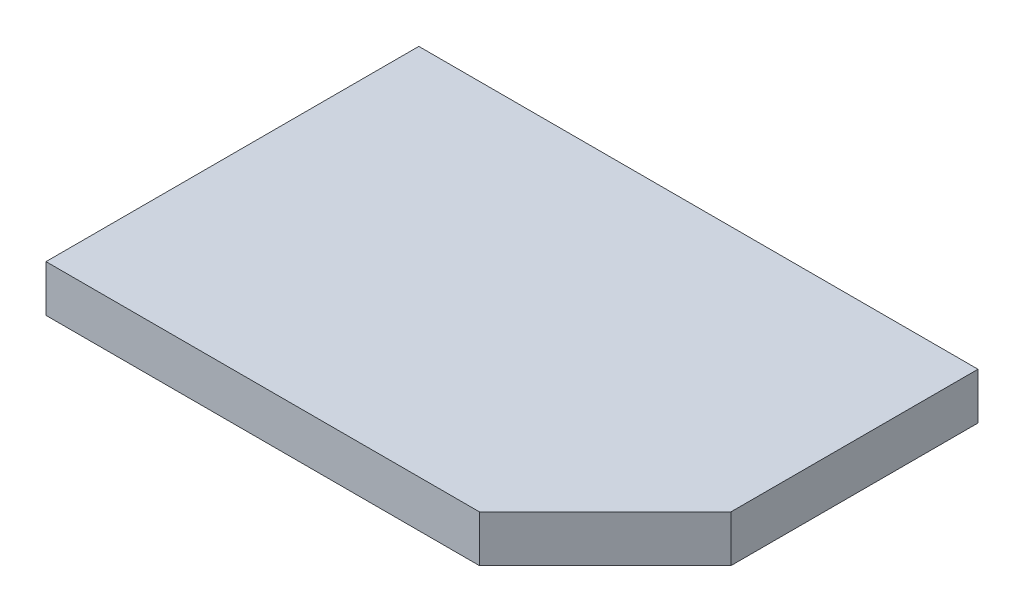
ISO-10303-21;
HEADER;
FILE_DESCRIPTION(('STEP AP214'),'2;1');
FILE_NAME('part.step','',(''),(''),'','','');
FILE_SCHEMA(('AUTOMOTIVE_DESIGN { 1 0 10303 214 1 1 1 1 }'));
ENDSEC;
DATA;
#1=APPLICATION_CONTEXT('core data for automotive mechanical design processes');
#2=APPLICATION_PROTOCOL_DEFINITION('international standard','automotive_design',2000,#1);
#3=PRODUCT_CONTEXT('',#1,'mechanical');
#4=PRODUCT('Part','Part','',(#3));
#5=PRODUCT_RELATED_PRODUCT_CATEGORY('part','',(#4));
#6=PRODUCT_DEFINITION_FORMATION('','',#4);
#7=PRODUCT_DEFINITION_CONTEXT('part definition',#1,'design');
#8=PRODUCT_DEFINITION('design','',#6,#7);
#9=PRODUCT_DEFINITION_SHAPE('','',#8);
#10=(LENGTH_UNIT() NAMED_UNIT(*) SI_UNIT(.MILLI.,.METRE.));
#11=(NAMED_UNIT(*) PLANE_ANGLE_UNIT() SI_UNIT($,.RADIAN.));
#12=(NAMED_UNIT(*) SI_UNIT($,.STERADIAN.) SOLID_ANGLE_UNIT());
#13=UNCERTAINTY_MEASURE_WITH_UNIT(LENGTH_MEASURE(1.E-05),#10,'distance_accuracy_value','');
#14=(GEOMETRIC_REPRESENTATION_CONTEXT(3) GLOBAL_UNCERTAINTY_ASSIGNED_CONTEXT((#13)) GLOBAL_UNIT_ASSIGNED_CONTEXT((#10,
#11,#12)) REPRESENTATION_CONTEXT('',''));
#15=CARTESIAN_POINT('',(0.,0.,0.));
#16=DIRECTION('',(0.,0.,1.));
#17=DIRECTION('',(1.,0.,0.));
#18=AXIS2_PLACEMENT_3D('',#15,#16,#17);
#19=CARTESIAN_POINT('',(-0.6,0.1,-0.4));
#20=DIRECTION('',(1.,0.,0.));
#21=DIRECTION('',(0.,0.,-1.));
#22=AXIS2_PLACEMENT_3D('',#19,#20,#21);
#23=PLANE('',#22);
#24=DIRECTION('',(0.,0.,1.));
#25=VECTOR('',#24,1.);
#26=CARTESIAN_POINT('',(-0.6,0.,-0.4));
#27=LINE('',#26,#25);
#28=CARTESIAN_POINT('',(-0.6,0.,-0.4));
#29=VERTEX_POINT('',#28);
#30=CARTESIAN_POINT('',(-0.6,0.,0.4));
#31=VERTEX_POINT('',#30);
#32=EDGE_CURVE('E95',#29,#31,#27,.T.);
#33=ORIENTED_EDGE('',*,*,#32,.T.);
#34=DIRECTION('',(0.,-1.,0.));
#35=VECTOR('',#34,1.);
#36=CARTESIAN_POINT('',(-0.6,0.1,0.4));
#37=LINE('',#36,#35);
#38=CARTESIAN_POINT('',(-0.6,0.1,0.4));
#39=VERTEX_POINT('',#38);
#40=EDGE_CURVE('E78',#39,#31,#37,.T.);
#41=ORIENTED_EDGE('',*,*,#40,.F.);
#42=DIRECTION('',(0.,0.,1.));
#43=VECTOR('',#42,1.);
#44=CARTESIAN_POINT('',(-0.6,0.1,-0.4));
#45=LINE('',#44,#43);
#46=CARTESIAN_POINT('',(-0.6,0.1,-0.4));
#47=VERTEX_POINT('',#46);
#48=EDGE_CURVE('E83',#47,#39,#45,.T.);
#49=ORIENTED_EDGE('',*,*,#48,.F.);
#50=DIRECTION('',(0.,-1.,0.));
#51=VECTOR('',#50,1.);
#52=CARTESIAN_POINT('',(-0.6,0.1,-0.4));
#53=LINE('',#52,#51);
#54=EDGE_CURVE('E102',#47,#29,#53,.T.);
#55=ORIENTED_EDGE('',*,*,#54,.T.);
#56=EDGE_LOOP('',(#33,#41,#49,#55));
#57=FACE_BOUND('',#56,.T.);
#58=ADVANCED_FACE('F31',(#57),#23,.F.);
#59=CARTESIAN_POINT('',(-0.6,0.1,0.4));
#60=DIRECTION('',(0.,0.,-1.));
#61=DIRECTION('',(-1.,0.,0.));
#62=AXIS2_PLACEMENT_3D('',#59,#60,#61);
#63=PLANE('',#62);
#64=DIRECTION('',(1.,0.,0.));
#65=VECTOR('',#64,1.);
#66=CARTESIAN_POINT('',(-0.6,0.,0.4));
#67=LINE('',#66,#65);
#68=CARTESIAN_POINT('',(0.329999999999999,0.,0.4));
#69=VERTEX_POINT('',#68);
#70=EDGE_CURVE('E110',#31,#69,#67,.T.);
#71=ORIENTED_EDGE('',*,*,#70,.T.);
#72=DIRECTION('',(0.,1.,0.));
#73=VECTOR('',#72,1.);
#74=CARTESIAN_POINT('',(0.329999999999999,0.1,0.4));
#75=LINE('',#74,#73);
#76=CARTESIAN_POINT('',(0.329999999999999,0.1,0.4));
#77=VERTEX_POINT('',#76);
#78=EDGE_CURVE('E39',#69,#77,#75,.T.);
#79=ORIENTED_EDGE('',*,*,#78,.T.);
#80=DIRECTION('',(1.,0.,0.));
#81=VECTOR('',#80,1.);
#82=CARTESIAN_POINT('',(-0.6,0.1,0.4));
#83=LINE('',#82,#81);
#84=EDGE_CURVE('E74',#39,#77,#83,.T.);
#85=ORIENTED_EDGE('',*,*,#84,.F.);
#86=ORIENTED_EDGE('',*,*,#40,.T.);
#87=EDGE_LOOP('',(#71,#79,#85,#86));
#88=FACE_BOUND('',#87,.T.);
#89=ADVANCED_FACE('F76',(#88),#63,.F.);
#90=CARTESIAN_POINT('',(0.6,0.1,-0.4));
#91=DIRECTION('',(-1.,0.,0.));
#92=DIRECTION('',(0.,0.,1.));
#93=AXIS2_PLACEMENT_3D('',#90,#91,#92);
#94=PLANE('',#93);
#95=DIRECTION('',(0.,0.,-1.));
#96=VECTOR('',#95,1.);
#97=CARTESIAN_POINT('',(0.6,0.1,-0.4));
#98=LINE('',#97,#96);
#99=CARTESIAN_POINT('',(0.6,0.1,0.13));
#100=VERTEX_POINT('',#99);
#101=CARTESIAN_POINT('',(0.6,0.1,-0.4));
#102=VERTEX_POINT('',#101);
#103=EDGE_CURVE('E82',#100,#102,#98,.T.);
#104=ORIENTED_EDGE('',*,*,#103,.F.);
#105=DIRECTION('',(0.,-1.,0.));
#106=VECTOR('',#105,1.);
#107=CARTESIAN_POINT('',(0.6,0.1,0.13));
#108=LINE('',#107,#106);
#109=CARTESIAN_POINT('',(0.6,0.,0.13));
#110=VERTEX_POINT('',#109);
#111=EDGE_CURVE('E96',#100,#110,#108,.T.);
#112=ORIENTED_EDGE('',*,*,#111,.T.);
#113=DIRECTION('',(0.,0.,-1.));
#114=VECTOR('',#113,1.);
#115=CARTESIAN_POINT('',(0.6,0.,-0.4));
#116=LINE('',#115,#114);
#117=CARTESIAN_POINT('',(0.6,0.,-0.4));
#118=VERTEX_POINT('',#117);
#119=EDGE_CURVE('E108',#110,#118,#116,.T.);
#120=ORIENTED_EDGE('',*,*,#119,.T.);
#121=DIRECTION('',(0.,-1.,0.));
#122=VECTOR('',#121,1.);
#123=CARTESIAN_POINT('',(0.6,0.1,-0.4));
#124=LINE('',#123,#122);
#125=EDGE_CURVE('E97',#102,#118,#124,.T.);
#126=ORIENTED_EDGE('',*,*,#125,.F.);
#127=EDGE_LOOP('',(#104,#112,#120,#126));
#128=FACE_BOUND('',#127,.T.);
#129=ADVANCED_FACE('F118',(#128),#94,.F.);
#130=CARTESIAN_POINT('',(-0.6,0.1,-0.4));
#131=DIRECTION('',(0.,0.,1.));
#132=DIRECTION('',(1.,0.,0.));
#133=AXIS2_PLACEMENT_3D('',#130,#131,#132);
#134=PLANE('',#133);
#135=DIRECTION('',(-1.,0.,0.));
#136=VECTOR('',#135,1.);
#137=CARTESIAN_POINT('',(-0.6,0.,-0.4));
#138=LINE('',#137,#136);
#139=EDGE_CURVE('E92',#118,#29,#138,.T.);
#140=ORIENTED_EDGE('',*,*,#139,.T.);
#141=ORIENTED_EDGE('',*,*,#54,.F.);
#142=DIRECTION('',(-1.,0.,0.));
#143=VECTOR('',#142,1.);
#144=CARTESIAN_POINT('',(-0.6,0.1,-0.4));
#145=LINE('',#144,#143);
#146=EDGE_CURVE('E88',#102,#47,#145,.T.);
#147=ORIENTED_EDGE('',*,*,#146,.F.);
#148=ORIENTED_EDGE('',*,*,#125,.T.);
#149=EDGE_LOOP('',(#140,#141,#147,#148));
#150=FACE_BOUND('',#149,.T.);
#151=ADVANCED_FACE('F121',(#150),#134,.F.);
#152=CARTESIAN_POINT('',(-0.6,0.1,0.4));
#153=DIRECTION('',(0.,1.,0.));
#154=DIRECTION('',(0.,0.,1.));
#155=AXIS2_PLACEMENT_3D('',#152,#153,#154);
#156=PLANE('',#155);
#157=ORIENTED_EDGE('',*,*,#84,.T.);
#158=DIRECTION('',(-0.707106781186548,0.,0.707106781186547));
#159=VECTOR('',#158,1.);
#160=CARTESIAN_POINT('',(-0.135000000000001,0.1,0.865));
#161=LINE('',#160,#159);
#162=EDGE_CURVE('E11',#77,#100,#161,.F.);
#163=ORIENTED_EDGE('',*,*,#162,.T.);
#164=ORIENTED_EDGE('',*,*,#103,.T.);
#165=ORIENTED_EDGE('',*,*,#146,.T.);
#166=ORIENTED_EDGE('',*,*,#48,.T.);
#167=EDGE_LOOP('',(#157,#163,#164,#165,#166));
#168=FACE_BOUND('',#167,.T.);
#169=ADVANCED_FACE('F86',(#168),#156,.T.);
#170=CARTESIAN_POINT('',(-0.6,0.,0.4));
#171=DIRECTION('',(0.,1.,0.));
#172=DIRECTION('',(0.,0.,1.));
#173=AXIS2_PLACEMENT_3D('',#170,#171,#172);
#174=PLANE('',#173);
#175=ORIENTED_EDGE('',*,*,#119,.F.);
#176=DIRECTION('',(0.707106781186548,0.,-0.707106781186547));
#177=VECTOR('',#176,1.);
#178=CARTESIAN_POINT('',(0.6,0.,0.13));
#179=LINE('',#178,#177);
#180=EDGE_CURVE('E53',#110,#69,#179,.F.);
#181=ORIENTED_EDGE('',*,*,#180,.T.);
#182=ORIENTED_EDGE('',*,*,#70,.F.);
#183=ORIENTED_EDGE('',*,*,#32,.F.);
#184=ORIENTED_EDGE('',*,*,#139,.F.);
#185=EDGE_LOOP('',(#175,#181,#182,#183,#184));
#186=FACE_BOUND('',#185,.T.);
#187=ADVANCED_FACE('F122',(#186),#174,.F.);
#188=CARTESIAN_POINT('',(0.6,0.1,0.13));
#189=DIRECTION('',(-0.707106781186547,0.,-0.707106781186548));
#190=DIRECTION('',(-0.707106781186548,0.,0.707106781186547));
#191=AXIS2_PLACEMENT_3D('',#188,#189,#190);
#192=PLANE('',#191);
#193=ORIENTED_EDGE('',*,*,#162,.F.);
#194=ORIENTED_EDGE('',*,*,#78,.F.);
#195=ORIENTED_EDGE('',*,*,#180,.F.);
#196=ORIENTED_EDGE('',*,*,#111,.F.);
#197=EDGE_LOOP('',(#193,#194,#195,#196));
#198=FACE_BOUND('',#197,.T.);
#199=ADVANCED_FACE('F33',(#198),#192,.F.);
#200=CLOSED_SHELL('',(#58,#89,#129,#151,#169,#187,#199));
#201=MANIFOLD_SOLID_BREP('B2',#200);
#202=ADVANCED_BREP_SHAPE_REPRESENTATION('',(#18,#201),#14);
#203=SHAPE_DEFINITION_REPRESENTATION(#9,#202);
ENDSEC;
END-ISO-10303-21;
